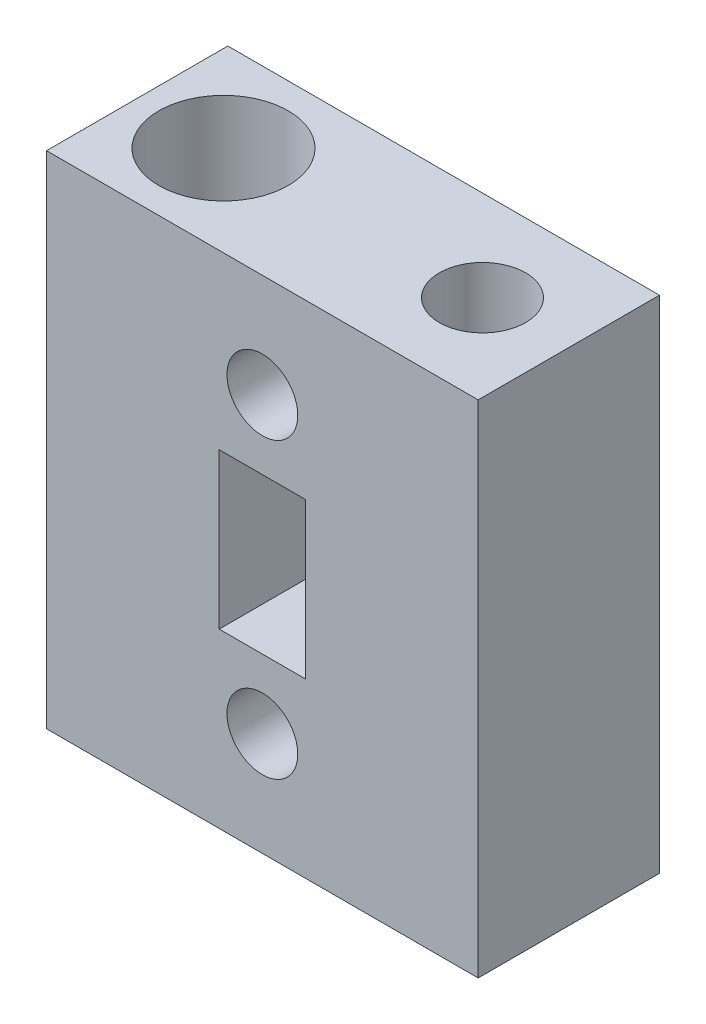
ISO-10303-21;
HEADER;
FILE_DESCRIPTION(('STEP AP214'),'2;1');
FILE_NAME('part.step','',(''),(''),'','','');
FILE_SCHEMA(('AUTOMOTIVE_DESIGN { 1 0 10303 214 1 1 1 1 }'));
ENDSEC;
DATA;
#1=APPLICATION_CONTEXT('core data for automotive mechanical design processes');
#2=APPLICATION_PROTOCOL_DEFINITION('international standard','automotive_design',2000,#1);
#3=PRODUCT_CONTEXT('',#1,'mechanical');
#4=PRODUCT('Part','Part','',(#3));
#5=PRODUCT_RELATED_PRODUCT_CATEGORY('part','',(#4));
#6=PRODUCT_DEFINITION_FORMATION('','',#4);
#7=PRODUCT_DEFINITION_CONTEXT('part definition',#1,'design');
#8=PRODUCT_DEFINITION('design','',#6,#7);
#9=PRODUCT_DEFINITION_SHAPE('','',#8);
#10=(LENGTH_UNIT() NAMED_UNIT(*) SI_UNIT(.MILLI.,.METRE.));
#11=(NAMED_UNIT(*) PLANE_ANGLE_UNIT() SI_UNIT($,.RADIAN.));
#12=(NAMED_UNIT(*) SI_UNIT($,.STERADIAN.) SOLID_ANGLE_UNIT());
#13=UNCERTAINTY_MEASURE_WITH_UNIT(LENGTH_MEASURE(1.E-05),#10,'distance_accuracy_value','');
#14=(GEOMETRIC_REPRESENTATION_CONTEXT(3) GLOBAL_UNCERTAINTY_ASSIGNED_CONTEXT((#13)) GLOBAL_UNIT_ASSIGNED_CONTEXT((#10,
#11,#12)) REPRESENTATION_CONTEXT('',''));
#15=CARTESIAN_POINT('',(0.,0.,0.));
#16=DIRECTION('',(0.,0.,1.));
#17=DIRECTION('',(1.,0.,0.));
#18=AXIS2_PLACEMENT_3D('',#15,#16,#17);
#19=CARTESIAN_POINT('',(25.,58.,-10.5));
#20=DIRECTION('',(-1.,0.,0.));
#21=DIRECTION('',(0.,0.,1.));
#22=AXIS2_PLACEMENT_3D('',#19,#20,#21);
#23=PLANE('',#22);
#24=DIRECTION('',(0.,0.,-1.));
#25=VECTOR('',#24,1.);
#26=CARTESIAN_POINT('',(25.,0.,-10.5));
#27=LINE('',#26,#25);
#28=CARTESIAN_POINT('',(25.,0.,10.5));
#29=VERTEX_POINT('',#28);
#30=CARTESIAN_POINT('',(25.,0.,-10.5));
#31=VERTEX_POINT('',#30);
#32=EDGE_CURVE('E155',#29,#31,#27,.T.);
#33=ORIENTED_EDGE('',*,*,#32,.T.);
#34=DIRECTION('',(0.,-1.,0.));
#35=VECTOR('',#34,1.);
#36=CARTESIAN_POINT('',(25.,58.,-10.5));
#37=LINE('',#36,#35);
#38=CARTESIAN_POINT('',(25.,58.,-10.5));
#39=VERTEX_POINT('',#38);
#40=EDGE_CURVE('E11',#39,#31,#37,.T.);
#41=ORIENTED_EDGE('',*,*,#40,.F.);
#42=DIRECTION('',(0.,0.,-1.));
#43=VECTOR('',#42,1.);
#44=CARTESIAN_POINT('',(25.,58.,-10.5));
#45=LINE('',#44,#43);
#46=CARTESIAN_POINT('',(25.,58.,10.5));
#47=VERTEX_POINT('',#46);
#48=EDGE_CURVE('E158',#47,#39,#45,.T.);
#49=ORIENTED_EDGE('',*,*,#48,.F.);
#50=DIRECTION('',(0.,-1.,0.));
#51=VECTOR('',#50,1.);
#52=CARTESIAN_POINT('',(25.,58.,10.5));
#53=LINE('',#52,#51);
#54=EDGE_CURVE('E168',#47,#29,#53,.T.);
#55=ORIENTED_EDGE('',*,*,#54,.T.);
#56=EDGE_LOOP('',(#33,#41,#49,#55));
#57=FACE_BOUND('',#56,.T.);
#58=ADVANCED_FACE('F33',(#57),#23,.F.);
#59=CARTESIAN_POINT('',(-25.,58.,-10.5));
#60=DIRECTION('',(0.,0.,1.));
#61=DIRECTION('',(1.,0.,0.));
#62=AXIS2_PLACEMENT_3D('',#59,#60,#61);
#63=PLANE('',#62);
#64=DIRECTION('',(-1.,0.,0.));
#65=VECTOR('',#64,1.);
#66=CARTESIAN_POINT('',(-5.,20.,-10.5));
#67=LINE('',#66,#65);
#68=CARTESIAN_POINT('',(5.,20.,-10.5));
#69=VERTEX_POINT('',#68);
#70=CARTESIAN_POINT('',(-5.,20.,-10.5));
#71=VERTEX_POINT('',#70);
#72=EDGE_CURVE('E117',#69,#71,#67,.T.);
#73=ORIENTED_EDGE('',*,*,#72,.F.);
#74=DIRECTION('',(0.,-1.,0.));
#75=VECTOR('',#74,1.);
#76=CARTESIAN_POINT('',(5.,20.,-10.5));
#77=LINE('',#76,#75);
#78=CARTESIAN_POINT('',(5.,38.,-10.5));
#79=VERTEX_POINT('',#78);
#80=EDGE_CURVE('E99',#79,#69,#77,.T.);
#81=ORIENTED_EDGE('',*,*,#80,.F.);
#82=DIRECTION('',(1.,0.,0.));
#83=VECTOR('',#82,1.);
#84=CARTESIAN_POINT('',(-5.,38.,-10.5));
#85=LINE('',#84,#83);
#86=CARTESIAN_POINT('',(-5.,38.,-10.5));
#87=VERTEX_POINT('',#86);
#88=EDGE_CURVE('E108',#87,#79,#85,.T.);
#89=ORIENTED_EDGE('',*,*,#88,.F.);
#90=DIRECTION('',(0.,1.,0.));
#91=VECTOR('',#90,1.);
#92=CARTESIAN_POINT('',(-5.,20.,-10.5));
#93=LINE('',#92,#91);
#94=EDGE_CURVE('E47',#71,#87,#93,.T.);
#95=ORIENTED_EDGE('',*,*,#94,.F.);
#96=EDGE_LOOP('',(#73,#81,#89,#95));
#97=FACE_BOUND('',#96,.T.);
#98=DIRECTION('',(-1.,0.,0.));
#99=VECTOR('',#98,1.);
#100=CARTESIAN_POINT('',(-25.,0.,-10.5));
#101=LINE('',#100,#99);
#102=CARTESIAN_POINT('',(-25.,0.,-10.5));
#103=VERTEX_POINT('',#102);
#104=EDGE_CURVE('E171',#31,#103,#101,.T.);
#105=ORIENTED_EDGE('',*,*,#104,.T.);
#106=DIRECTION('',(0.,-1.,0.));
#107=VECTOR('',#106,1.);
#108=CARTESIAN_POINT('',(-25.,58.,-10.5));
#109=LINE('',#108,#107);
#110=CARTESIAN_POINT('',(-25.,58.,-10.5));
#111=VERTEX_POINT('',#110);
#112=EDGE_CURVE('E40',#111,#103,#109,.T.);
#113=ORIENTED_EDGE('',*,*,#112,.F.);
#114=DIRECTION('',(-1.,0.,0.));
#115=VECTOR('',#114,1.);
#116=CARTESIAN_POINT('',(-25.,58.,-10.5));
#117=LINE('',#116,#115);
#118=EDGE_CURVE('E161',#39,#111,#117,.T.);
#119=ORIENTED_EDGE('',*,*,#118,.F.);
#120=ORIENTED_EDGE('',*,*,#40,.T.);
#121=EDGE_LOOP('',(#105,#113,#119,#120));
#122=FACE_BOUND('',#121,.T.);
#123=ADVANCED_FACE('F114',(#97,#122),#63,.F.);
#124=CARTESIAN_POINT('',(-25.,58.,-10.5));
#125=DIRECTION('',(1.,0.,0.));
#126=DIRECTION('',(0.,0.,-1.));
#127=AXIS2_PLACEMENT_3D('',#124,#125,#126);
#128=PLANE('',#127);
#129=DIRECTION('',(0.,0.,1.));
#130=VECTOR('',#129,1.);
#131=CARTESIAN_POINT('',(-25.,0.,-10.5));
#132=LINE('',#131,#130);
#133=CARTESIAN_POINT('',(-25.,0.,10.5));
#134=VERTEX_POINT('',#133);
#135=EDGE_CURVE('E173',#103,#134,#132,.T.);
#136=ORIENTED_EDGE('',*,*,#135,.T.);
#137=DIRECTION('',(0.,-1.,0.));
#138=VECTOR('',#137,1.);
#139=CARTESIAN_POINT('',(-25.,58.,10.5));
#140=LINE('',#139,#138);
#141=CARTESIAN_POINT('',(-25.,58.,10.5));
#142=VERTEX_POINT('',#141);
#143=EDGE_CURVE('E178',#142,#134,#140,.T.);
#144=ORIENTED_EDGE('',*,*,#143,.F.);
#145=DIRECTION('',(0.,0.,1.));
#146=VECTOR('',#145,1.);
#147=CARTESIAN_POINT('',(-25.,58.,-10.5));
#148=LINE('',#147,#146);
#149=EDGE_CURVE('E164',#111,#142,#148,.T.);
#150=ORIENTED_EDGE('',*,*,#149,.F.);
#151=ORIENTED_EDGE('',*,*,#112,.T.);
#152=EDGE_LOOP('',(#136,#144,#150,#151));
#153=FACE_BOUND('',#152,.T.);
#154=ADVANCED_FACE('F185',(#153),#128,.F.);
#155=CARTESIAN_POINT('',(-25.,58.,10.5));
#156=DIRECTION('',(0.,0.,-1.));
#157=DIRECTION('',(-1.,0.,0.));
#158=AXIS2_PLACEMENT_3D('',#155,#156,#157);
#159=PLANE('',#158);
#160=CARTESIAN_POINT('',(0.,46.,10.5));
#161=DIRECTION('',(0.,0.,1.));
#162=DIRECTION('',(1.,0.,0.));
#163=AXIS2_PLACEMENT_3D('',#160,#161,#162);
#164=CIRCLE('',#163,4.1);
#165=CARTESIAN_POINT('',(4.1,46.,10.5));
#166=VERTEX_POINT('',#165);
#167=EDGE_CURVE('E271',#166,#166,#164,.T.);
#168=ORIENTED_EDGE('',*,*,#167,.F.);
#169=EDGE_LOOP('',(#168));
#170=FACE_BOUND('',#169,.T.);
#171=CARTESIAN_POINT('',(0.,12.,10.5));
#172=DIRECTION('',(0.,0.,1.));
#173=DIRECTION('',(-1.,0.,0.));
#174=AXIS2_PLACEMENT_3D('',#171,#172,#173);
#175=CIRCLE('',#174,4.1);
#176=CARTESIAN_POINT('',(-4.1,12.,10.5));
#177=VERTEX_POINT('',#176);
#178=EDGE_CURVE('E279',#177,#177,#175,.T.);
#179=ORIENTED_EDGE('',*,*,#178,.F.);
#180=EDGE_LOOP('',(#179));
#181=FACE_BOUND('',#180,.T.);
#182=DIRECTION('',(-1.,0.,0.));
#183=VECTOR('',#182,1.);
#184=CARTESIAN_POINT('',(-5.,38.,10.5));
#185=LINE('',#184,#183);
#186=CARTESIAN_POINT('',(5.,38.,10.5));
#187=VERTEX_POINT('',#186);
#188=CARTESIAN_POINT('',(-5.,38.,10.5));
#189=VERTEX_POINT('',#188);
#190=EDGE_CURVE('E119',#187,#189,#185,.T.);
#191=ORIENTED_EDGE('',*,*,#190,.F.);
#192=DIRECTION('',(0.,1.,0.));
#193=VECTOR('',#192,1.);
#194=CARTESIAN_POINT('',(5.,20.,10.5));
#195=LINE('',#194,#193);
#196=CARTESIAN_POINT('',(5.,20.,10.5));
#197=VERTEX_POINT('',#196);
#198=EDGE_CURVE('E55',#197,#187,#195,.T.);
#199=ORIENTED_EDGE('',*,*,#198,.F.);
#200=DIRECTION('',(1.,0.,0.));
#201=VECTOR('',#200,1.);
#202=CARTESIAN_POINT('',(-5.,20.,10.5));
#203=LINE('',#202,#201);
#204=CARTESIAN_POINT('',(-5.,20.,10.5));
#205=VERTEX_POINT('',#204);
#206=EDGE_CURVE('E105',#205,#197,#203,.T.);
#207=ORIENTED_EDGE('',*,*,#206,.F.);
#208=DIRECTION('',(0.,-1.,0.));
#209=VECTOR('',#208,1.);
#210=CARTESIAN_POINT('',(-5.,20.,10.5));
#211=LINE('',#210,#209);
#212=EDGE_CURVE('E125',#189,#205,#211,.T.);
#213=ORIENTED_EDGE('',*,*,#212,.F.);
#214=EDGE_LOOP('',(#191,#199,#207,#213));
#215=FACE_BOUND('',#214,.T.);
#216=DIRECTION('',(1.,0.,0.));
#217=VECTOR('',#216,1.);
#218=CARTESIAN_POINT('',(-25.,0.,10.5));
#219=LINE('',#218,#217);
#220=EDGE_CURVE('E162',#134,#29,#219,.T.);
#221=ORIENTED_EDGE('',*,*,#220,.T.);
#222=ORIENTED_EDGE('',*,*,#54,.F.);
#223=DIRECTION('',(1.,0.,0.));
#224=VECTOR('',#223,1.);
#225=CARTESIAN_POINT('',(-25.,58.,10.5));
#226=LINE('',#225,#224);
#227=EDGE_CURVE('E166',#142,#47,#226,.T.);
#228=ORIENTED_EDGE('',*,*,#227,.F.);
#229=ORIENTED_EDGE('',*,*,#143,.T.);
#230=EDGE_LOOP('',(#221,#222,#228,#229));
#231=FACE_BOUND('',#230,.T.);
#232=ADVANCED_FACE('F193',(#170,#181,#215,#231),#159,.F.);
#233=CARTESIAN_POINT('',(0.,58.,0.));
#234=DIRECTION('',(0.,1.,0.));
#235=DIRECTION('',(0.,0.,1.));
#236=AXIS2_PLACEMENT_3D('',#233,#234,#235);
#237=PLANE('',#236);
#238=CARTESIAN_POINT('',(15.,58.,0.));
#239=DIRECTION('',(0.,1.,0.));
#240=DIRECTION('',(0.,0.,1.));
#241=AXIS2_PLACEMENT_3D('',#238,#239,#240);
#242=CIRCLE('',#241,5.);
#243=CARTESIAN_POINT('',(15.,58.,5.));
#244=VERTEX_POINT('',#243);
#245=EDGE_CURVE('E143',#244,#244,#242,.T.);
#246=ORIENTED_EDGE('',*,*,#245,.F.);
#247=EDGE_LOOP('',(#246));
#248=FACE_BOUND('',#247,.T.);
#249=CARTESIAN_POINT('',(-15.,58.,0.));
#250=DIRECTION('',(0.,1.,0.));
#251=DIRECTION('',(0.,0.,1.));
#252=AXIS2_PLACEMENT_3D('',#249,#250,#251);
#253=CIRCLE('',#252,7.5);
#254=CARTESIAN_POINT('',(-15.,58.,7.5));
#255=VERTEX_POINT('',#254);
#256=EDGE_CURVE('E151',#255,#255,#253,.T.);
#257=ORIENTED_EDGE('',*,*,#256,.F.);
#258=EDGE_LOOP('',(#257));
#259=FACE_BOUND('',#258,.T.);
#260=ORIENTED_EDGE('',*,*,#48,.T.);
#261=ORIENTED_EDGE('',*,*,#118,.T.);
#262=ORIENTED_EDGE('',*,*,#149,.T.);
#263=ORIENTED_EDGE('',*,*,#227,.T.);
#264=EDGE_LOOP('',(#260,#261,#262,#263));
#265=FACE_BOUND('',#264,.T.);
#266=ADVANCED_FACE('F199',(#248,#259,#265),#237,.T.);
#267=CARTESIAN_POINT('',(0.,0.,0.));
#268=DIRECTION('',(0.,1.,0.));
#269=DIRECTION('',(0.,0.,1.));
#270=AXIS2_PLACEMENT_3D('',#267,#268,#269);
#271=PLANE('',#270);
#272=CARTESIAN_POINT('',(-15.,0.,0.));
#273=DIRECTION('',(0.,-1.,0.));
#274=DIRECTION('',(0.,0.,-1.));
#275=AXIS2_PLACEMENT_3D('',#272,#273,#274);
#276=CIRCLE('',#275,7.5);
#277=CARTESIAN_POINT('',(-15.,0.,-7.5));
#278=VERTEX_POINT('',#277);
#279=EDGE_CURVE('E139',#278,#278,#276,.T.);
#280=ORIENTED_EDGE('',*,*,#279,.F.);
#281=EDGE_LOOP('',(#280));
#282=FACE_BOUND('',#281,.T.);
#283=CARTESIAN_POINT('',(15.,0.,0.));
#284=DIRECTION('',(0.,1.,0.));
#285=DIRECTION('',(0.,0.,1.));
#286=AXIS2_PLACEMENT_3D('',#283,#284,#285);
#287=CIRCLE('',#286,5.);
#288=CARTESIAN_POINT('',(15.,0.,5.));
#289=VERTEX_POINT('',#288);
#290=EDGE_CURVE('E148',#289,#289,#287,.F.);
#291=ORIENTED_EDGE('',*,*,#290,.F.);
#292=EDGE_LOOP('',(#291));
#293=FACE_BOUND('',#292,.T.);
#294=ORIENTED_EDGE('',*,*,#32,.F.);
#295=ORIENTED_EDGE('',*,*,#220,.F.);
#296=ORIENTED_EDGE('',*,*,#135,.F.);
#297=ORIENTED_EDGE('',*,*,#104,.F.);
#298=EDGE_LOOP('',(#294,#295,#296,#297));
#299=FACE_BOUND('',#298,.T.);
#300=ADVANCED_FACE('F190',(#282,#293,#299),#271,.F.);
#301=CARTESIAN_POINT('',(-15.,34.,0.));
#302=DIRECTION('',(0.,1.,0.));
#303=DIRECTION('',(0.,0.,1.));
#304=AXIS2_PLACEMENT_3D('',#301,#302,#303);
#305=CYLINDRICAL_SURFACE('',#304,7.5);
#306=CARTESIAN_POINT('',(-15.,34.,0.));
#307=DIRECTION('',(0.,1.,0.));
#308=DIRECTION('',(0.,0.,1.));
#309=AXIS2_PLACEMENT_3D('',#306,#307,#308);
#310=CIRCLE('',#309,7.5);
#311=CARTESIAN_POINT('',(-15.,34.,7.5));
#312=VERTEX_POINT('',#311);
#313=EDGE_CURVE('E152',#312,#312,#310,.T.);
#314=ORIENTED_EDGE('',*,*,#313,.F.);
#315=EDGE_LOOP('',(#314));
#316=FACE_BOUND('',#315,.T.);
#317=ORIENTED_EDGE('',*,*,#256,.T.);
#318=EDGE_LOOP('',(#317));
#319=FACE_BOUND('',#318,.T.);
#320=ADVANCED_FACE('F212',(#316,#319),#305,.F.);
#321=CARTESIAN_POINT('',(-15.,34.,0.));
#322=DIRECTION('',(0.,1.,0.));
#323=DIRECTION('',(0.,0.,1.));
#324=AXIS2_PLACEMENT_3D('',#321,#322,#323);
#325=PLANE('',#324);
#326=CARTESIAN_POINT('',(-15.,34.,0.));
#327=DIRECTION('',(0.,1.,0.));
#328=DIRECTION('',(0.,0.,1.));
#329=AXIS2_PLACEMENT_3D('',#326,#327,#328);
#330=CIRCLE('',#329,4.5);
#331=CARTESIAN_POINT('',(-15.,34.,4.5));
#332=VERTEX_POINT('',#331);
#333=EDGE_CURVE('E136',#332,#332,#330,.F.);
#334=ORIENTED_EDGE('',*,*,#333,.T.);
#335=EDGE_LOOP('',(#334));
#336=FACE_BOUND('',#335,.T.);
#337=ORIENTED_EDGE('',*,*,#313,.T.);
#338=EDGE_LOOP('',(#337));
#339=FACE_BOUND('',#338,.T.);
#340=ADVANCED_FACE('F219',(#336,#339),#325,.T.);
#341=CARTESIAN_POINT('',(15.,-0.001000000000001,0.));
#342=DIRECTION('',(0.,1.,0.));
#343=DIRECTION('',(0.,0.,1.));
#344=AXIS2_PLACEMENT_3D('',#341,#342,#343);
#345=CYLINDRICAL_SURFACE('',#344,5.);
#346=ORIENTED_EDGE('',*,*,#245,.T.);
#347=EDGE_LOOP('',(#346));
#348=FACE_BOUND('',#347,.T.);
#349=ORIENTED_EDGE('',*,*,#290,.T.);
#350=EDGE_LOOP('',(#349));
#351=FACE_BOUND('',#350,.T.);
#352=ADVANCED_FACE('F223',(#348,#351),#345,.F.);
#353=CARTESIAN_POINT('',(-15.,24.,0.));
#354=DIRECTION('',(0.,-1.,0.));
#355=DIRECTION('',(0.,0.,-1.));
#356=AXIS2_PLACEMENT_3D('',#353,#354,#355);
#357=CYLINDRICAL_SURFACE('',#356,7.5);
#358=CARTESIAN_POINT('',(-15.,24.,0.));
#359=DIRECTION('',(0.,-1.,0.));
#360=DIRECTION('',(0.,0.,-1.));
#361=AXIS2_PLACEMENT_3D('',#358,#359,#360);
#362=CIRCLE('',#361,7.5);
#363=CARTESIAN_POINT('',(-15.,24.,-7.5));
#364=VERTEX_POINT('',#363);
#365=EDGE_CURVE('E140',#364,#364,#362,.T.);
#366=ORIENTED_EDGE('',*,*,#365,.F.);
#367=EDGE_LOOP('',(#366));
#368=FACE_BOUND('',#367,.T.);
#369=ORIENTED_EDGE('',*,*,#279,.T.);
#370=EDGE_LOOP('',(#369));
#371=FACE_BOUND('',#370,.T.);
#372=ADVANCED_FACE('F227',(#368,#371),#357,.F.);
#373=CARTESIAN_POINT('',(-15.,24.,0.));
#374=DIRECTION('',(0.,-1.,0.));
#375=DIRECTION('',(0.,0.,-1.));
#376=AXIS2_PLACEMENT_3D('',#373,#374,#375);
#377=PLANE('',#376);
#378=CARTESIAN_POINT('',(-15.,24.,0.));
#379=DIRECTION('',(0.,-1.,0.));
#380=DIRECTION('',(0.,0.,-1.));
#381=AXIS2_PLACEMENT_3D('',#378,#379,#380);
#382=CIRCLE('',#381,4.5);
#383=CARTESIAN_POINT('',(-15.,24.,-4.5));
#384=VERTEX_POINT('',#383);
#385=EDGE_CURVE('E111',#384,#384,#382,.F.);
#386=ORIENTED_EDGE('',*,*,#385,.T.);
#387=EDGE_LOOP('',(#386));
#388=FACE_BOUND('',#387,.T.);
#389=ORIENTED_EDGE('',*,*,#365,.T.);
#390=EDGE_LOOP('',(#389));
#391=FACE_BOUND('',#390,.T.);
#392=ADVANCED_FACE('F231',(#388,#391),#377,.T.);
#393=CARTESIAN_POINT('',(-15.,58.001,0.));
#394=DIRECTION('',(0.,-1.,0.));
#395=DIRECTION('',(0.,0.,-1.));
#396=AXIS2_PLACEMENT_3D('',#393,#394,#395);
#397=CYLINDRICAL_SURFACE('',#396,4.5);
#398=ORIENTED_EDGE('',*,*,#333,.F.);
#399=EDGE_LOOP('',(#398));
#400=FACE_BOUND('',#399,.T.);
#401=ORIENTED_EDGE('',*,*,#385,.F.);
#402=EDGE_LOOP('',(#401));
#403=FACE_BOUND('',#402,.T.);
#404=ADVANCED_FACE('F235',(#400,#403),#397,.F.);
#405=CARTESIAN_POINT('',(5.,20.,-10.501));
#406=DIRECTION('',(1.,0.,0.));
#407=DIRECTION('',(0.,0.,-1.));
#408=AXIS2_PLACEMENT_3D('',#405,#406,#407);
#409=PLANE('',#408);
#410=ORIENTED_EDGE('',*,*,#80,.T.);
#411=DIRECTION('',(0.,0.,1.));
#412=VECTOR('',#411,1.);
#413=CARTESIAN_POINT('',(5.,20.,-10.501));
#414=LINE('',#413,#412);
#415=EDGE_CURVE('E112',#69,#197,#414,.T.);
#416=ORIENTED_EDGE('',*,*,#415,.T.);
#417=ORIENTED_EDGE('',*,*,#198,.T.);
#418=DIRECTION('',(0.,0.,1.));
#419=VECTOR('',#418,1.);
#420=CARTESIAN_POINT('',(5.,38.,-10.501));
#421=LINE('',#420,#419);
#422=EDGE_CURVE('E95',#79,#187,#421,.T.);
#423=ORIENTED_EDGE('',*,*,#422,.F.);
#424=EDGE_LOOP('',(#410,#416,#417,#423));
#425=FACE_BOUND('',#424,.T.);
#426=ADVANCED_FACE('F97',(#425),#409,.F.);
#427=CARTESIAN_POINT('',(-5.,20.,-10.501));
#428=DIRECTION('',(0.,-1.,0.));
#429=DIRECTION('',(0.,0.,-1.));
#430=AXIS2_PLACEMENT_3D('',#427,#428,#429);
#431=PLANE('',#430);
#432=ORIENTED_EDGE('',*,*,#72,.T.);
#433=DIRECTION('',(0.,0.,1.));
#434=VECTOR('',#433,1.);
#435=CARTESIAN_POINT('',(-5.,20.,-10.501));
#436=LINE('',#435,#434);
#437=EDGE_CURVE('E131',#71,#205,#436,.T.);
#438=ORIENTED_EDGE('',*,*,#437,.T.);
#439=ORIENTED_EDGE('',*,*,#206,.T.);
#440=ORIENTED_EDGE('',*,*,#415,.F.);
#441=EDGE_LOOP('',(#432,#438,#439,#440));
#442=FACE_BOUND('',#441,.T.);
#443=ADVANCED_FACE('F242',(#442),#431,.F.);
#444=CARTESIAN_POINT('',(-5.,20.,-10.501));
#445=DIRECTION('',(-1.,0.,0.));
#446=DIRECTION('',(0.,0.,1.));
#447=AXIS2_PLACEMENT_3D('',#444,#445,#446);
#448=PLANE('',#447);
#449=ORIENTED_EDGE('',*,*,#94,.T.);
#450=DIRECTION('',(0.,0.,1.));
#451=VECTOR('',#450,1.);
#452=CARTESIAN_POINT('',(-5.,38.,-10.501));
#453=LINE('',#452,#451);
#454=EDGE_CURVE('E104',#87,#189,#453,.T.);
#455=ORIENTED_EDGE('',*,*,#454,.T.);
#456=ORIENTED_EDGE('',*,*,#212,.T.);
#457=ORIENTED_EDGE('',*,*,#437,.F.);
#458=EDGE_LOOP('',(#449,#455,#456,#457));
#459=FACE_BOUND('',#458,.T.);
#460=ADVANCED_FACE('F246',(#459),#448,.F.);
#461=CARTESIAN_POINT('',(-5.,38.,-10.501));
#462=DIRECTION('',(0.,1.,0.));
#463=DIRECTION('',(0.,0.,1.));
#464=AXIS2_PLACEMENT_3D('',#461,#462,#463);
#465=PLANE('',#464);
#466=ORIENTED_EDGE('',*,*,#88,.T.);
#467=ORIENTED_EDGE('',*,*,#422,.T.);
#468=ORIENTED_EDGE('',*,*,#190,.T.);
#469=ORIENTED_EDGE('',*,*,#454,.F.);
#470=EDGE_LOOP('',(#466,#467,#468,#469));
#471=FACE_BOUND('',#470,.T.);
#472=ADVANCED_FACE('F109',(#471),#465,.F.);
#473=CARTESIAN_POINT('',(0.,12.,-4.5));
#474=DIRECTION('',(0.,0.,1.));
#475=DIRECTION('',(1.,0.,0.));
#476=AXIS2_PLACEMENT_3D('',#473,#474,#475);
#477=CYLINDRICAL_SURFACE('',#476,4.1);
#478=CARTESIAN_POINT('',(0.,12.,-4.5));
#479=DIRECTION('',(0.,0.,1.));
#480=DIRECTION('',(-1.,0.,0.));
#481=AXIS2_PLACEMENT_3D('',#478,#479,#480);
#482=CIRCLE('',#481,4.1);
#483=CARTESIAN_POINT('',(-4.1,12.,-4.5));
#484=VERTEX_POINT('',#483);
#485=EDGE_CURVE('E274',#484,#484,#482,.T.);
#486=ORIENTED_EDGE('',*,*,#485,.F.);
#487=EDGE_LOOP('',(#486));
#488=FACE_BOUND('',#487,.T.);
#489=ORIENTED_EDGE('',*,*,#178,.T.);
#490=EDGE_LOOP('',(#489));
#491=FACE_BOUND('',#490,.T.);
#492=ADVANCED_FACE('F245',(#488,#491),#477,.F.);
#493=CARTESIAN_POINT('',(0.,12.,-4.5));
#494=DIRECTION('',(0.,0.,-1.));
#495=DIRECTION('',(-1.,0.,0.));
#496=AXIS2_PLACEMENT_3D('',#493,#494,#495);
#497=PLANE('',#496);
#498=ORIENTED_EDGE('',*,*,#485,.T.);
#499=EDGE_LOOP('',(#498));
#500=FACE_BOUND('',#499,.T.);
#501=ADVANCED_FACE('F254',(#500),#497,.F.);
#502=CARTESIAN_POINT('',(0.,46.,-4.5));
#503=DIRECTION('',(0.,0.,1.));
#504=DIRECTION('',(1.,0.,0.));
#505=AXIS2_PLACEMENT_3D('',#502,#503,#504);
#506=CYLINDRICAL_SURFACE('',#505,4.1);
#507=CARTESIAN_POINT('',(0.,46.,-4.5));
#508=DIRECTION('',(0.,0.,1.));
#509=DIRECTION('',(1.,0.,0.));
#510=AXIS2_PLACEMENT_3D('',#507,#508,#509);
#511=CIRCLE('',#510,4.1);
#512=CARTESIAN_POINT('',(4.1,46.,-4.5));
#513=VERTEX_POINT('',#512);
#514=EDGE_CURVE('E270',#513,#513,#511,.T.);
#515=ORIENTED_EDGE('',*,*,#514,.F.);
#516=EDGE_LOOP('',(#515));
#517=FACE_BOUND('',#516,.T.);
#518=ORIENTED_EDGE('',*,*,#167,.T.);
#519=EDGE_LOOP('',(#518));
#520=FACE_BOUND('',#519,.T.);
#521=ADVANCED_FACE('F258',(#517,#520),#506,.F.);
#522=CARTESIAN_POINT('',(0.,46.,-4.5));
#523=DIRECTION('',(0.,0.,1.));
#524=DIRECTION('',(1.,0.,0.));
#525=AXIS2_PLACEMENT_3D('',#522,#523,#524);
#526=PLANE('',#525);
#527=ORIENTED_EDGE('',*,*,#514,.T.);
#528=EDGE_LOOP('',(#527));
#529=FACE_BOUND('',#528,.T.);
#530=ADVANCED_FACE('F262',(#529),#526,.T.);
#531=CLOSED_SHELL('',(#58,#123,#154,#232,#266,#300,#320,#340,#352,#372,#392,#404,#426,#443,#460,
#472,#492,#501,#521,#530));
#532=MANIFOLD_SOLID_BREP('B2',#531);
#533=ADVANCED_BREP_SHAPE_REPRESENTATION('',(#18,#532),#14);
#534=SHAPE_DEFINITION_REPRESENTATION(#9,#533);
ENDSEC;
END-ISO-10303-21;
